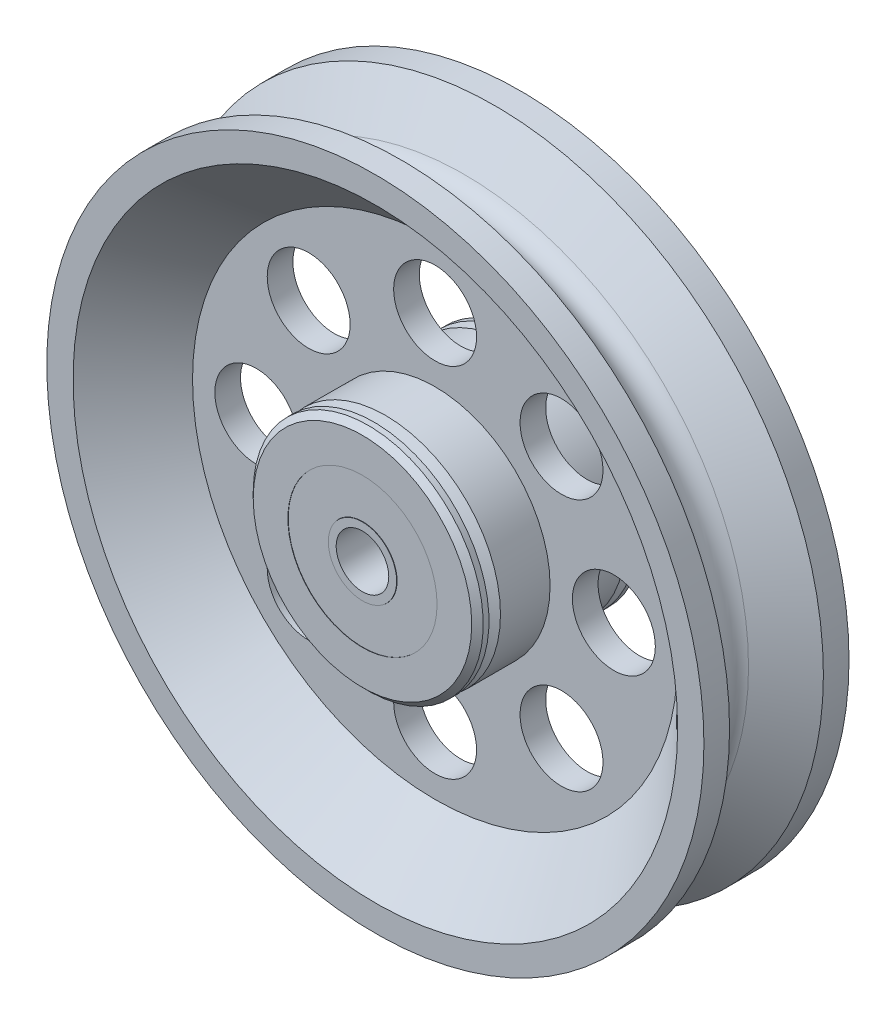
ISO-10303-21;
HEADER;
FILE_DESCRIPTION(('STEP AP214'),'2;1');
FILE_NAME('part.step','',(''),(''),'','','');
FILE_SCHEMA(('AUTOMOTIVE_DESIGN { 1 0 10303 214 1 1 1 1 }'));
ENDSEC;
DATA;
#1=APPLICATION_CONTEXT('core data for automotive mechanical design processes');
#2=APPLICATION_PROTOCOL_DEFINITION('international standard','automotive_design',2000,#1);
#3=PRODUCT_CONTEXT('',#1,'mechanical');
#4=PRODUCT('Part','Part','',(#3));
#5=PRODUCT_RELATED_PRODUCT_CATEGORY('part','',(#4));
#6=PRODUCT_DEFINITION_FORMATION('','',#4);
#7=PRODUCT_DEFINITION_CONTEXT('part definition',#1,'design');
#8=PRODUCT_DEFINITION('design','',#6,#7);
#9=PRODUCT_DEFINITION_SHAPE('','',#8);
#10=(LENGTH_UNIT() NAMED_UNIT(*) SI_UNIT(.MILLI.,.METRE.));
#11=(NAMED_UNIT(*) PLANE_ANGLE_UNIT() SI_UNIT($,.RADIAN.));
#12=(NAMED_UNIT(*) SI_UNIT($,.STERADIAN.) SOLID_ANGLE_UNIT());
#13=UNCERTAINTY_MEASURE_WITH_UNIT(LENGTH_MEASURE(1.E-05),#10,'distance_accuracy_value','');
#14=(GEOMETRIC_REPRESENTATION_CONTEXT(3) GLOBAL_UNCERTAINTY_ASSIGNED_CONTEXT((#13)) GLOBAL_UNIT_ASSIGNED_CONTEXT((#10,
#11,#12)) REPRESENTATION_CONTEXT('',''));
#15=CARTESIAN_POINT('',(0.,0.,0.));
#16=DIRECTION('',(0.,0.,1.));
#17=DIRECTION('',(1.,0.,0.));
#18=AXIS2_PLACEMENT_3D('',#15,#16,#17);
#19=CARTESIAN_POINT('',(0.,0.,20.6375));
#20=DIRECTION('',(0.,0.,1.));
#21=DIRECTION('',(1.,0.,0.));
#22=AXIS2_PLACEMENT_3D('',#19,#20,#21);
#23=CYLINDRICAL_SURFACE('',#22,27.78125);
#24=CARTESIAN_POINT('',(0.,0.,-17.859375));
#25=DIRECTION('',(0.,0.,-1.));
#26=DIRECTION('',(-1.,0.,0.));
#27=AXIS2_PLACEMENT_3D('',#24,#25,#26);
#28=CIRCLE('',#27,27.78125);
#29=CARTESIAN_POINT('',(-27.78125,0.,-17.859375));
#30=VERTEX_POINT('',#29);
#31=EDGE_CURVE('E129',#30,#30,#28,.T.);
#32=ORIENTED_EDGE('',*,*,#31,.T.);
#33=EDGE_LOOP('',(#32));
#34=FACE_BOUND('',#33,.T.);
#35=CARTESIAN_POINT('',(0.,0.,-19.2484375));
#36=DIRECTION('',(0.,0.,1.));
#37=DIRECTION('',(1.,0.,0.));
#38=AXIS2_PLACEMENT_3D('',#35,#36,#37);
#39=CIRCLE('',#38,27.78125);
#40=CARTESIAN_POINT('',(27.78125,0.,-19.2484375));
#41=VERTEX_POINT('',#40);
#42=EDGE_CURVE('E191',#41,#41,#39,.T.);
#43=ORIENTED_EDGE('',*,*,#42,.T.);
#44=EDGE_LOOP('',(#43));
#45=FACE_BOUND('',#44,.T.);
#46=ADVANCED_FACE('F57',(#34,#45),#23,.T.);
#47=CARTESIAN_POINT('',(0.,0.,20.6375));
#48=DIRECTION('',(0.,0.,1.));
#49=DIRECTION('',(1.,0.,0.));
#50=AXIS2_PLACEMENT_3D('',#47,#48,#49);
#51=CYLINDRICAL_SURFACE('',#50,27.78125);
#52=CARTESIAN_POINT('',(0.,0.,17.859375));
#53=DIRECTION('',(0.,0.,-1.));
#54=DIRECTION('',(-1.,0.,0.));
#55=AXIS2_PLACEMENT_3D('',#52,#53,#54);
#56=CIRCLE('',#55,27.78125);
#57=CARTESIAN_POINT('',(-27.78125,0.,17.859375));
#58=VERTEX_POINT('',#57);
#59=EDGE_CURVE('E138',#58,#58,#56,.T.);
#60=ORIENTED_EDGE('',*,*,#59,.F.);
#61=EDGE_LOOP('',(#60));
#62=FACE_BOUND('',#61,.T.);
#63=CARTESIAN_POINT('',(0.,0.,19.2484375));
#64=DIRECTION('',(0.,0.,-1.));
#65=DIRECTION('',(-1.,0.,0.));
#66=AXIS2_PLACEMENT_3D('',#63,#64,#65);
#67=CIRCLE('',#66,27.78125);
#68=CARTESIAN_POINT('',(-27.78125,0.,19.2484375));
#69=VERTEX_POINT('',#68);
#70=EDGE_CURVE('E12',#69,#69,#67,.T.);
#71=ORIENTED_EDGE('',*,*,#70,.T.);
#72=EDGE_LOOP('',(#71));
#73=FACE_BOUND('',#72,.T.);
#74=ADVANCED_FACE('F210',(#62,#73),#51,.T.);
#75=CARTESIAN_POINT('',(0.,0.,0.));
#76=DIRECTION('',(0.,0.,1.));
#77=DIRECTION('',(1.,0.,0.));
#78=AXIS2_PLACEMENT_3D('',#75,#76,#77);
#79=TOROIDAL_SURFACE('',#78,71.4375,4.76249999999999);
#80=CARTESIAN_POINT('',(0.,0.,3.9075855517827));
#81=DIRECTION('',(0.,0.,1.));
#82=DIRECTION('',(1.,0.,0.));
#83=AXIS2_PLACEMENT_3D('',#80,#81,#82);
#84=CIRCLE('',#83,68.7149678320543);
#85=CARTESIAN_POINT('',(68.7149678320543,0.,3.9075855517827));
#86=VERTEX_POINT('',#85);
#87=EDGE_CURVE('E147',#86,#86,#84,.T.);
#88=ORIENTED_EDGE('',*,*,#87,.F.);
#89=EDGE_LOOP('',(#88));
#90=FACE_BOUND('',#89,.T.);
#91=CARTESIAN_POINT('',(0.,0.,-3.9075855517827));
#92=DIRECTION('',(0.,0.,1.));
#93=DIRECTION('',(1.,0.,0.));
#94=AXIS2_PLACEMENT_3D('',#91,#92,#93);
#95=CIRCLE('',#94,68.7149678320543);
#96=CARTESIAN_POINT('',(68.7149678320543,0.,-3.9075855517827));
#97=VERTEX_POINT('',#96);
#98=EDGE_CURVE('E141',#97,#97,#95,.T.);
#99=ORIENTED_EDGE('',*,*,#98,.T.);
#100=EDGE_LOOP('',(#99));
#101=FACE_BOUND('',#100,.T.);
#102=ADVANCED_FACE('F217',(#90,#101),#79,.F.);
#103=CARTESIAN_POINT('',(0.,0.,3.9075855517827));
#104=DIRECTION('',(0.,0.,1.));
#105=DIRECTION('',(1.,0.,0.));
#106=AXIS2_PLACEMENT_3D('',#103,#104,#105);
#107=CONICAL_SURFACE('',#106,68.7149678320543,0.962268351515033);
#108=CARTESIAN_POINT('',(0.,0.,11.33475));
#109=DIRECTION('',(0.,0.,1.));
#110=DIRECTION('',(1.,0.,0.));
#111=AXIS2_PLACEMENT_3D('',#108,#109,#110);
#112=CIRCLE('',#111,79.375);
#113=CARTESIAN_POINT('',(79.375,0.,11.33475));
#114=VERTEX_POINT('',#113);
#115=EDGE_CURVE('E150',#114,#114,#112,.T.);
#116=ORIENTED_EDGE('',*,*,#115,.F.);
#117=EDGE_LOOP('',(#116));
#118=FACE_BOUND('',#117,.T.);
#119=ORIENTED_EDGE('',*,*,#87,.T.);
#120=EDGE_LOOP('',(#119));
#121=FACE_BOUND('',#120,.T.);
#122=ADVANCED_FACE('F264',(#118,#121),#107,.T.);
#123=CARTESIAN_POINT('',(0.,0.,20.6375));
#124=DIRECTION('',(0.,0.,1.));
#125=DIRECTION('',(1.,0.,0.));
#126=AXIS2_PLACEMENT_3D('',#123,#124,#125);
#127=CYLINDRICAL_SURFACE('',#126,79.375);
#128=CARTESIAN_POINT('',(0.,0.,17.526));
#129=DIRECTION('',(0.,0.,1.));
#130=DIRECTION('',(1.,0.,0.));
#131=AXIS2_PLACEMENT_3D('',#128,#129,#130);
#132=CIRCLE('',#131,79.375);
#133=CARTESIAN_POINT('',(79.375,0.,17.526));
#134=VERTEX_POINT('',#133);
#135=EDGE_CURVE('E153',#134,#134,#132,.T.);
#136=ORIENTED_EDGE('',*,*,#135,.F.);
#137=EDGE_LOOP('',(#136));
#138=FACE_BOUND('',#137,.T.);
#139=ORIENTED_EDGE('',*,*,#115,.T.);
#140=EDGE_LOOP('',(#139));
#141=FACE_BOUND('',#140,.T.);
#142=ADVANCED_FACE('F268',(#138,#141),#127,.T.);
#143=CARTESIAN_POINT('',(0.,73.025,17.526));
#144=DIRECTION('',(0.,0.,-1.));
#145=DIRECTION('',(-1.,0.,0.));
#146=AXIS2_PLACEMENT_3D('',#143,#144,#145);
#147=PLANE('',#146);
#148=CARTESIAN_POINT('',(0.,0.,17.526));
#149=DIRECTION('',(0.,0.,1.));
#150=DIRECTION('',(1.,0.,0.));
#151=AXIS2_PLACEMENT_3D('',#148,#149,#150);
#152=CIRCLE('',#151,73.025);
#153=CARTESIAN_POINT('',(73.025,0.,17.526));
#154=VERTEX_POINT('',#153);
#155=EDGE_CURVE('E156',#154,#154,#152,.T.);
#156=ORIENTED_EDGE('',*,*,#155,.F.);
#157=EDGE_LOOP('',(#156));
#158=FACE_BOUND('',#157,.T.);
#159=ORIENTED_EDGE('',*,*,#135,.T.);
#160=EDGE_LOOP('',(#159));
#161=FACE_BOUND('',#160,.T.);
#162=ADVANCED_FACE('F272',(#158,#161),#147,.F.);
#163=CARTESIAN_POINT('',(0.,0.,17.526));
#164=DIRECTION('',(0.,0.,1.));
#165=DIRECTION('',(1.,0.,0.));
#166=AXIS2_PLACEMENT_3D('',#163,#164,#165);
#167=CONICAL_SURFACE('',#166,73.025,0.785398163397446);
#168=CARTESIAN_POINT('',(0.,0.,3.09562499999999));
#169=DIRECTION('',(0.,0.,1.));
#170=DIRECTION('',(1.,0.,0.));
#171=AXIS2_PLACEMENT_3D('',#168,#169,#170);
#172=CIRCLE('',#171,58.5946250000001);
#173=CARTESIAN_POINT('',(58.5946250000001,0.,3.09562499999999));
#174=VERTEX_POINT('',#173);
#175=EDGE_CURVE('E159',#174,#174,#172,.T.);
#176=ORIENTED_EDGE('',*,*,#175,.F.);
#177=EDGE_LOOP('',(#176));
#178=FACE_BOUND('',#177,.T.);
#179=ORIENTED_EDGE('',*,*,#155,.T.);
#180=EDGE_LOOP('',(#179));
#181=FACE_BOUND('',#180,.T.);
#182=ADVANCED_FACE('F276',(#178,#181),#167,.F.);
#183=CARTESIAN_POINT('',(0.,58.5946250000001,3.095625));
#184=DIRECTION('',(0.,0.,-1.));
#185=DIRECTION('',(-1.,0.,0.));
#186=AXIS2_PLACEMENT_3D('',#183,#184,#185);
#187=PLANE('',#186);
#188=CARTESIAN_POINT('',(30.5384834717104,30.5384834717112,3.095625));
#189=DIRECTION('',(0.,0.,-1.));
#190=DIRECTION('',(-1.,0.,0.));
#191=AXIS2_PLACEMENT_3D('',#188,#189,#190);
#192=CIRCLE('',#191,10.014346875);
#193=CARTESIAN_POINT('',(20.5241365967104,30.5384834717112,3.095625));
#194=VERTEX_POINT('',#193);
#195=EDGE_CURVE('E100',#194,#194,#192,.T.);
#196=ORIENTED_EDGE('',*,*,#195,.T.);
#197=EDGE_LOOP('',(#196));
#198=FACE_BOUND('',#197,.T.);
#199=CARTESIAN_POINT('',(43.1879375,4.51583234245091E-13,3.095625));
#200=DIRECTION('',(0.,0.,-1.));
#201=DIRECTION('',(-1.,0.,0.));
#202=AXIS2_PLACEMENT_3D('',#199,#200,#201);
#203=CIRCLE('',#202,10.014346875);
#204=CARTESIAN_POINT('',(33.173590625,4.51583234245091E-13,3.095625));
#205=VERTEX_POINT('',#204);
#206=EDGE_CURVE('E97',#205,#205,#203,.T.);
#207=ORIENTED_EDGE('',*,*,#206,.T.);
#208=EDGE_LOOP('',(#207));
#209=FACE_BOUND('',#208,.T.);
#210=CARTESIAN_POINT('',(30.5384834717111,-30.5384834717105,3.095625));
#211=DIRECTION('',(0.,0.,-1.));
#212=DIRECTION('',(-1.,0.,0.));
#213=AXIS2_PLACEMENT_3D('',#210,#211,#212);
#214=CIRCLE('',#213,10.014346875);
#215=CARTESIAN_POINT('',(20.5241365967111,-30.5384834717105,3.095625));
#216=VERTEX_POINT('',#215);
#217=EDGE_CURVE('E94',#216,#216,#214,.T.);
#218=ORIENTED_EDGE('',*,*,#217,.T.);
#219=EDGE_LOOP('',(#218));
#220=FACE_BOUND('',#219,.T.);
#221=CARTESIAN_POINT('',(0.,-43.1879375,3.095625));
#222=DIRECTION('',(0.,0.,-1.));
#223=DIRECTION('',(-1.,0.,0.));
#224=AXIS2_PLACEMENT_3D('',#221,#222,#223);
#225=CIRCLE('',#224,10.014346875);
#226=CARTESIAN_POINT('',(-10.014346875,-43.1879375,3.095625));
#227=VERTEX_POINT('',#226);
#228=EDGE_CURVE('E90',#227,#227,#225,.T.);
#229=ORIENTED_EDGE('',*,*,#228,.T.);
#230=EDGE_LOOP('',(#229));
#231=FACE_BOUND('',#230,.T.);
#232=CARTESIAN_POINT('',(-30.5384834717107,-30.538483471711,3.095625));
#233=DIRECTION('',(0.,0.,-1.));
#234=DIRECTION('',(-1.,0.,0.));
#235=AXIS2_PLACEMENT_3D('',#232,#233,#234);
#236=CIRCLE('',#235,10.014346875);
#237=CARTESIAN_POINT('',(-40.5528303467107,-30.538483471711,3.095625));
#238=VERTEX_POINT('',#237);
#239=EDGE_CURVE('E86',#238,#238,#236,.T.);
#240=ORIENTED_EDGE('',*,*,#239,.T.);
#241=EDGE_LOOP('',(#240));
#242=FACE_BOUND('',#241,.T.);
#243=CARTESIAN_POINT('',(-43.1879375,-1.50003478556344E-13,3.095625));
#244=DIRECTION('',(0.,0.,-1.));
#245=DIRECTION('',(-1.,0.,0.));
#246=AXIS2_PLACEMENT_3D('',#243,#244,#245);
#247=CIRCLE('',#246,10.014346875);
#248=CARTESIAN_POINT('',(-53.2022843750001,-1.50003478556344E-13,3.095625));
#249=VERTEX_POINT('',#248);
#250=EDGE_CURVE('E82',#249,#249,#247,.T.);
#251=ORIENTED_EDGE('',*,*,#250,.T.);
#252=EDGE_LOOP('',(#251));
#253=FACE_BOUND('',#252,.T.);
#254=CARTESIAN_POINT('',(-30.5384834717109,30.5384834717108,3.095625));
#255=DIRECTION('',(0.,0.,-1.));
#256=DIRECTION('',(-1.,0.,0.));
#257=AXIS2_PLACEMENT_3D('',#254,#255,#256);
#258=CIRCLE('',#257,10.014346875);
#259=CARTESIAN_POINT('',(-40.5528303467109,30.5384834717108,3.095625));
#260=VERTEX_POINT('',#259);
#261=EDGE_CURVE('E78',#260,#260,#258,.T.);
#262=ORIENTED_EDGE('',*,*,#261,.T.);
#263=EDGE_LOOP('',(#262));
#264=FACE_BOUND('',#263,.T.);
#265=CARTESIAN_POINT('',(0.,43.1879375,3.095625));
#266=DIRECTION('',(0.,0.,-1.));
#267=DIRECTION('',(-1.,0.,0.));
#268=AXIS2_PLACEMENT_3D('',#265,#266,#267);
#269=CIRCLE('',#268,10.014346875);
#270=CARTESIAN_POINT('',(-10.014346875,43.1879375,3.095625));
#271=VERTEX_POINT('',#270);
#272=EDGE_CURVE('E77',#271,#271,#269,.T.);
#273=ORIENTED_EDGE('',*,*,#272,.T.);
#274=EDGE_LOOP('',(#273));
#275=FACE_BOUND('',#274,.T.);
#276=CARTESIAN_POINT('',(0.,0.,3.095625));
#277=DIRECTION('',(0.,0.,1.));
#278=DIRECTION('',(1.,0.,0.));
#279=AXIS2_PLACEMENT_3D('',#276,#277,#278);
#280=CIRCLE('',#279,27.78125);
#281=CARTESIAN_POINT('',(27.78125,0.,3.095625));
#282=VERTEX_POINT('',#281);
#283=EDGE_CURVE('E162',#282,#282,#280,.T.);
#284=ORIENTED_EDGE('',*,*,#283,.F.);
#285=EDGE_LOOP('',(#284));
#286=FACE_BOUND('',#285,.T.);
#287=ORIENTED_EDGE('',*,*,#175,.T.);
#288=EDGE_LOOP('',(#287));
#289=FACE_BOUND('',#288,.T.);
#290=ADVANCED_FACE('F280',(#198,#209,#220,#231,#242,#253,#264,#275,#286,#289),#187,.F.);
#291=CARTESIAN_POINT('',(0.,0.,15.08125));
#292=DIRECTION('',(0.,0.,-1.));
#293=DIRECTION('',(-1.,0.,0.));
#294=AXIS2_PLACEMENT_3D('',#291,#292,#293);
#295=CIRCLE('',#294,27.78125);
#296=CARTESIAN_POINT('',(-27.78125,0.,15.08125));
#297=VERTEX_POINT('',#296);
#298=EDGE_CURVE('E132',#297,#297,#295,.T.);
#299=ORIENTED_EDGE('',*,*,#298,.T.);
#300=EDGE_LOOP('',(#299));
#301=FACE_BOUND('',#300,.T.);
#302=ORIENTED_EDGE('',*,*,#283,.T.);
#303=EDGE_LOOP('',(#302));
#304=FACE_BOUND('',#303,.T.);
#305=ADVANCED_FACE('F220',(#301,#304),#51,.T.);
#306=CARTESIAN_POINT('',(0.,18.018125,20.6375));
#307=DIRECTION('',(0.,0.,-1.));
#308=DIRECTION('',(-1.,0.,0.));
#309=AXIS2_PLACEMENT_3D('',#306,#307,#308);
#310=PLANE('',#309);
#311=CARTESIAN_POINT('',(0.,0.,20.6375));
#312=DIRECTION('',(0.,0.,-1.));
#313=DIRECTION('',(-1.,0.,0.));
#314=AXIS2_PLACEMENT_3D('',#311,#312,#313);
#315=CIRCLE('',#314,26.3921875);
#316=CARTESIAN_POINT('',(-26.3921875,0.,20.6375));
#317=VERTEX_POINT('',#316);
#318=EDGE_CURVE('E65',#317,#317,#315,.F.);
#319=ORIENTED_EDGE('',*,*,#318,.T.);
#320=EDGE_LOOP('',(#319));
#321=FACE_BOUND('',#320,.T.);
#322=CARTESIAN_POINT('',(0.,0.,20.6375));
#323=DIRECTION('',(0.,0.,1.));
#324=DIRECTION('',(1.,0.,0.));
#325=AXIS2_PLACEMENT_3D('',#322,#323,#324);
#326=CIRCLE('',#325,18.018125);
#327=CARTESIAN_POINT('',(18.018125,0.,20.6375));
#328=VERTEX_POINT('',#327);
#329=EDGE_CURVE('E165',#328,#328,#326,.T.);
#330=ORIENTED_EDGE('',*,*,#329,.F.);
#331=EDGE_LOOP('',(#330));
#332=FACE_BOUND('',#331,.T.);
#333=ADVANCED_FACE('F285',(#321,#332),#310,.F.);
#334=CARTESIAN_POINT('',(0.,0.,20.6375));
#335=DIRECTION('',(0.,0.,1.));
#336=DIRECTION('',(1.,0.,0.));
#337=AXIS2_PLACEMENT_3D('',#334,#335,#336);
#338=CYLINDRICAL_SURFACE('',#337,18.018125);
#339=CARTESIAN_POINT('',(0.,0.,20.5613));
#340=DIRECTION('',(0.,0.,1.));
#341=DIRECTION('',(1.,0.,0.));
#342=AXIS2_PLACEMENT_3D('',#339,#340,#341);
#343=CIRCLE('',#342,18.018125);
#344=CARTESIAN_POINT('',(18.018125,0.,20.5613));
#345=VERTEX_POINT('',#344);
#346=EDGE_CURVE('E146',#345,#345,#343,.T.);
#347=ORIENTED_EDGE('',*,*,#346,.F.);
#348=EDGE_LOOP('',(#347));
#349=FACE_BOUND('',#348,.T.);
#350=ORIENTED_EDGE('',*,*,#329,.T.);
#351=EDGE_LOOP('',(#350));
#352=FACE_BOUND('',#351,.T.);
#353=ADVANCED_FACE('F289',(#349,#352),#338,.F.);
#354=CARTESIAN_POINT('',(0.,8.255,20.5613));
#355=DIRECTION('',(0.,0.,-1.));
#356=DIRECTION('',(-1.,0.,0.));
#357=AXIS2_PLACEMENT_3D('',#354,#355,#356);
#358=PLANE('',#357);
#359=CARTESIAN_POINT('',(0.,0.,20.5613));
#360=DIRECTION('',(0.,0.,-1.));
#361=DIRECTION('',(-1.,0.,0.));
#362=AXIS2_PLACEMENT_3D('',#359,#360,#361);
#363=CIRCLE('',#362,8.2804);
#364=CARTESIAN_POINT('',(-8.2804,0.,20.5613));
#365=VERTEX_POINT('',#364);
#366=EDGE_CURVE('E168',#365,#365,#363,.T.);
#367=ORIENTED_EDGE('',*,*,#366,.T.);
#368=EDGE_LOOP('',(#367));
#369=FACE_BOUND('',#368,.T.);
#370=ORIENTED_EDGE('',*,*,#346,.T.);
#371=EDGE_LOOP('',(#370));
#372=FACE_BOUND('',#371,.T.);
#373=ADVANCED_FACE('F293',(#369,#372),#358,.F.);
#374=CARTESIAN_POINT('',(0.,18.018125,-20.5613));
#375=DIRECTION('',(0.,0.,1.));
#376=DIRECTION('',(1.,0.,0.));
#377=AXIS2_PLACEMENT_3D('',#374,#375,#376);
#378=PLANE('',#377);
#379=CARTESIAN_POINT('',(0.,0.,-20.5613));
#380=DIRECTION('',(0.,0.,1.));
#381=DIRECTION('',(1.,0.,0.));
#382=AXIS2_PLACEMENT_3D('',#379,#380,#381);
#383=CIRCLE('',#382,8.2804);
#384=CARTESIAN_POINT('',(8.2804,0.,-20.5613));
#385=VERTEX_POINT('',#384);
#386=EDGE_CURVE('E142',#385,#385,#383,.T.);
#387=ORIENTED_EDGE('',*,*,#386,.T.);
#388=EDGE_LOOP('',(#387));
#389=FACE_BOUND('',#388,.T.);
#390=CARTESIAN_POINT('',(0.,0.,-20.5613));
#391=DIRECTION('',(0.,0.,1.));
#392=DIRECTION('',(1.,0.,0.));
#393=AXIS2_PLACEMENT_3D('',#390,#391,#392);
#394=CIRCLE('',#393,18.018125);
#395=CARTESIAN_POINT('',(18.018125,0.,-20.5613));
#396=VERTEX_POINT('',#395);
#397=EDGE_CURVE('E145',#396,#396,#394,.T.);
#398=ORIENTED_EDGE('',*,*,#397,.F.);
#399=EDGE_LOOP('',(#398));
#400=FACE_BOUND('',#399,.T.);
#401=ADVANCED_FACE('F297',(#389,#400),#378,.F.);
#402=CARTESIAN_POINT('',(0.,0.,20.6375));
#403=DIRECTION('',(0.,0.,1.));
#404=DIRECTION('',(1.,0.,0.));
#405=AXIS2_PLACEMENT_3D('',#402,#403,#404);
#406=CYLINDRICAL_SURFACE('',#405,18.018125);
#407=CARTESIAN_POINT('',(0.,0.,-20.6375));
#408=DIRECTION('',(0.,0.,1.));
#409=DIRECTION('',(1.,0.,0.));
#410=AXIS2_PLACEMENT_3D('',#407,#408,#409);
#411=CIRCLE('',#410,18.018125);
#412=CARTESIAN_POINT('',(18.018125,0.,-20.6375));
#413=VERTEX_POINT('',#412);
#414=EDGE_CURVE('E173',#413,#413,#411,.T.);
#415=ORIENTED_EDGE('',*,*,#414,.F.);
#416=EDGE_LOOP('',(#415));
#417=FACE_BOUND('',#416,.T.);
#418=ORIENTED_EDGE('',*,*,#397,.T.);
#419=EDGE_LOOP('',(#418));
#420=FACE_BOUND('',#419,.T.);
#421=ADVANCED_FACE('F232',(#417,#420),#406,.F.);
#422=CARTESIAN_POINT('',(0.,27.78125,-20.6375));
#423=DIRECTION('',(0.,0.,1.));
#424=DIRECTION('',(1.,0.,0.));
#425=AXIS2_PLACEMENT_3D('',#422,#423,#424);
#426=PLANE('',#425);
#427=CARTESIAN_POINT('',(0.,0.,-20.6375));
#428=DIRECTION('',(0.,0.,1.));
#429=DIRECTION('',(1.,0.,0.));
#430=AXIS2_PLACEMENT_3D('',#427,#428,#429);
#431=CIRCLE('',#430,26.3921875);
#432=CARTESIAN_POINT('',(26.3921875,0.,-20.6375));
#433=VERTEX_POINT('',#432);
#434=EDGE_CURVE('E70',#433,#433,#431,.F.);
#435=ORIENTED_EDGE('',*,*,#434,.T.);
#436=EDGE_LOOP('',(#435));
#437=FACE_BOUND('',#436,.T.);
#438=ORIENTED_EDGE('',*,*,#414,.T.);
#439=EDGE_LOOP('',(#438));
#440=FACE_BOUND('',#439,.T.);
#441=ADVANCED_FACE('F200',(#437,#440),#426,.F.);
#442=CARTESIAN_POINT('',(0.,0.,-15.08125));
#443=DIRECTION('',(0.,0.,-1.));
#444=DIRECTION('',(-1.,0.,0.));
#445=AXIS2_PLACEMENT_3D('',#442,#443,#444);
#446=CIRCLE('',#445,27.78125);
#447=CARTESIAN_POINT('',(-27.78125,0.,-15.08125));
#448=VERTEX_POINT('',#447);
#449=EDGE_CURVE('E123',#448,#448,#446,.T.);
#450=ORIENTED_EDGE('',*,*,#449,.F.);
#451=EDGE_LOOP('',(#450));
#452=FACE_BOUND('',#451,.T.);
#453=CARTESIAN_POINT('',(0.,0.,-3.095625));
#454=DIRECTION('',(0.,0.,1.));
#455=DIRECTION('',(1.,0.,0.));
#456=AXIS2_PLACEMENT_3D('',#453,#454,#455);
#457=CIRCLE('',#456,27.78125);
#458=CARTESIAN_POINT('',(27.78125,0.,-3.095625));
#459=VERTEX_POINT('',#458);
#460=EDGE_CURVE('E176',#459,#459,#457,.T.);
#461=ORIENTED_EDGE('',*,*,#460,.F.);
#462=EDGE_LOOP('',(#461));
#463=FACE_BOUND('',#462,.T.);
#464=ADVANCED_FACE('F213',(#452,#463),#23,.T.);
#465=CARTESIAN_POINT('',(0.,58.5946250000001,-3.095625));
#466=DIRECTION('',(0.,0.,1.));
#467=DIRECTION('',(1.,0.,0.));
#468=AXIS2_PLACEMENT_3D('',#465,#466,#467);
#469=PLANE('',#468);
#470=CARTESIAN_POINT('',(30.5384834717104,30.5384834717112,-3.095625));
#471=DIRECTION('',(0.,0.,1.));
#472=DIRECTION('',(1.,0.,0.));
#473=AXIS2_PLACEMENT_3D('',#470,#471,#472);
#474=CIRCLE('',#473,10.014346875);
#475=CARTESIAN_POINT('',(40.5528303467105,30.5384834717112,-3.095625));
#476=VERTEX_POINT('',#475);
#477=EDGE_CURVE('E61',#476,#476,#474,.T.);
#478=ORIENTED_EDGE('',*,*,#477,.T.);
#479=EDGE_LOOP('',(#478));
#480=FACE_BOUND('',#479,.T.);
#481=CARTESIAN_POINT('',(43.1879375,4.51583234245091E-13,-3.095625));
#482=DIRECTION('',(0.,0.,1.));
#483=DIRECTION('',(1.,0.,0.));
#484=AXIS2_PLACEMENT_3D('',#481,#482,#483);
#485=CIRCLE('',#484,10.014346875);
#486=CARTESIAN_POINT('',(53.2022843750001,4.51583234245091E-13,-3.095625));
#487=VERTEX_POINT('',#486);
#488=EDGE_CURVE('E98',#487,#487,#485,.T.);
#489=ORIENTED_EDGE('',*,*,#488,.T.);
#490=EDGE_LOOP('',(#489));
#491=FACE_BOUND('',#490,.T.);
#492=CARTESIAN_POINT('',(30.5384834717111,-30.5384834717105,-3.095625));
#493=DIRECTION('',(0.,0.,1.));
#494=DIRECTION('',(1.,0.,0.));
#495=AXIS2_PLACEMENT_3D('',#492,#493,#494);
#496=CIRCLE('',#495,10.014346875);
#497=CARTESIAN_POINT('',(40.5528303467111,-30.5384834717105,-3.095625));
#498=VERTEX_POINT('',#497);
#499=EDGE_CURVE('E95',#498,#498,#496,.T.);
#500=ORIENTED_EDGE('',*,*,#499,.T.);
#501=EDGE_LOOP('',(#500));
#502=FACE_BOUND('',#501,.T.);
#503=CARTESIAN_POINT('',(0.,-43.1879375,-3.095625));
#504=DIRECTION('',(0.,0.,1.));
#505=DIRECTION('',(1.,0.,0.));
#506=AXIS2_PLACEMENT_3D('',#503,#504,#505);
#507=CIRCLE('',#506,10.014346875);
#508=CARTESIAN_POINT('',(10.014346875,-43.1879375,-3.095625));
#509=VERTEX_POINT('',#508);
#510=EDGE_CURVE('E91',#509,#509,#507,.T.);
#511=ORIENTED_EDGE('',*,*,#510,.T.);
#512=EDGE_LOOP('',(#511));
#513=FACE_BOUND('',#512,.T.);
#514=CARTESIAN_POINT('',(-30.5384834717107,-30.538483471711,-3.095625));
#515=DIRECTION('',(0.,0.,1.));
#516=DIRECTION('',(1.,0.,0.));
#517=AXIS2_PLACEMENT_3D('',#514,#515,#516);
#518=CIRCLE('',#517,10.014346875);
#519=CARTESIAN_POINT('',(-20.5241365967106,-30.538483471711,-3.095625));
#520=VERTEX_POINT('',#519);
#521=EDGE_CURVE('E87',#520,#520,#518,.T.);
#522=ORIENTED_EDGE('',*,*,#521,.T.);
#523=EDGE_LOOP('',(#522));
#524=FACE_BOUND('',#523,.T.);
#525=CARTESIAN_POINT('',(-43.1879375,-1.50003478556344E-13,-3.095625));
#526=DIRECTION('',(0.,0.,1.));
#527=DIRECTION('',(1.,0.,0.));
#528=AXIS2_PLACEMENT_3D('',#525,#526,#527);
#529=CIRCLE('',#528,10.014346875);
#530=CARTESIAN_POINT('',(-33.173590625,-1.50003478556344E-13,-3.095625));
#531=VERTEX_POINT('',#530);
#532=EDGE_CURVE('E83',#531,#531,#529,.T.);
#533=ORIENTED_EDGE('',*,*,#532,.T.);
#534=EDGE_LOOP('',(#533));
#535=FACE_BOUND('',#534,.T.);
#536=CARTESIAN_POINT('',(-30.5384834717109,30.5384834717108,-3.095625));
#537=DIRECTION('',(0.,0.,1.));
#538=DIRECTION('',(1.,0.,0.));
#539=AXIS2_PLACEMENT_3D('',#536,#537,#538);
#540=CIRCLE('',#539,10.014346875);
#541=CARTESIAN_POINT('',(-20.5241365967108,30.5384834717108,-3.095625));
#542=VERTEX_POINT('',#541);
#543=EDGE_CURVE('E79',#542,#542,#540,.T.);
#544=ORIENTED_EDGE('',*,*,#543,.T.);
#545=EDGE_LOOP('',(#544));
#546=FACE_BOUND('',#545,.T.);
#547=CARTESIAN_POINT('',(0.,43.1879375,-3.095625));
#548=DIRECTION('',(0.,0.,1.));
#549=DIRECTION('',(1.,0.,0.));
#550=AXIS2_PLACEMENT_3D('',#547,#548,#549);
#551=CIRCLE('',#550,10.014346875);
#552=CARTESIAN_POINT('',(10.014346875,43.1879375,-3.095625));
#553=VERTEX_POINT('',#552);
#554=EDGE_CURVE('E74',#553,#553,#551,.T.);
#555=ORIENTED_EDGE('',*,*,#554,.T.);
#556=EDGE_LOOP('',(#555));
#557=FACE_BOUND('',#556,.T.);
#558=CARTESIAN_POINT('',(0.,0.,-3.095625));
#559=DIRECTION('',(0.,0.,1.));
#560=DIRECTION('',(1.,0.,0.));
#561=AXIS2_PLACEMENT_3D('',#558,#559,#560);
#562=CIRCLE('',#561,58.5946250000001);
#563=CARTESIAN_POINT('',(58.5946250000001,0.,-3.095625));
#564=VERTEX_POINT('',#563);
#565=EDGE_CURVE('E179',#564,#564,#562,.T.);
#566=ORIENTED_EDGE('',*,*,#565,.F.);
#567=EDGE_LOOP('',(#566));
#568=FACE_BOUND('',#567,.T.);
#569=ORIENTED_EDGE('',*,*,#460,.T.);
#570=EDGE_LOOP('',(#569));
#571=FACE_BOUND('',#570,.T.);
#572=ADVANCED_FACE('F224',(#480,#491,#502,#513,#524,#535,#546,#557,#568,#571),#469,.F.);
#573=CARTESIAN_POINT('',(0.,0.,-3.095625));
#574=DIRECTION('',(0.,0.,-1.));
#575=DIRECTION('',(-1.,0.,0.));
#576=AXIS2_PLACEMENT_3D('',#573,#574,#575);
#577=CONICAL_SURFACE('',#576,58.5946250000001,0.785398163397446);
#578=CARTESIAN_POINT('',(0.,0.,-17.526));
#579=DIRECTION('',(0.,0.,1.));
#580=DIRECTION('',(1.,0.,0.));
#581=AXIS2_PLACEMENT_3D('',#578,#579,#580);
#582=CIRCLE('',#581,73.025);
#583=CARTESIAN_POINT('',(73.025,0.,-17.526));
#584=VERTEX_POINT('',#583);
#585=EDGE_CURVE('E182',#584,#584,#582,.T.);
#586=ORIENTED_EDGE('',*,*,#585,.F.);
#587=EDGE_LOOP('',(#586));
#588=FACE_BOUND('',#587,.T.);
#589=ORIENTED_EDGE('',*,*,#565,.T.);
#590=EDGE_LOOP('',(#589));
#591=FACE_BOUND('',#590,.T.);
#592=ADVANCED_FACE('F230',(#588,#591),#577,.F.);
#593=CARTESIAN_POINT('',(0.,79.375,-17.526));
#594=DIRECTION('',(0.,0.,1.));
#595=DIRECTION('',(1.,0.,0.));
#596=AXIS2_PLACEMENT_3D('',#593,#594,#595);
#597=PLANE('',#596);
#598=CARTESIAN_POINT('',(0.,0.,-17.526));
#599=DIRECTION('',(0.,0.,1.));
#600=DIRECTION('',(1.,0.,0.));
#601=AXIS2_PLACEMENT_3D('',#598,#599,#600);
#602=CIRCLE('',#601,79.375);
#603=CARTESIAN_POINT('',(79.375,0.,-17.526));
#604=VERTEX_POINT('',#603);
#605=EDGE_CURVE('E185',#604,#604,#602,.T.);
#606=ORIENTED_EDGE('',*,*,#605,.F.);
#607=EDGE_LOOP('',(#606));
#608=FACE_BOUND('',#607,.T.);
#609=ORIENTED_EDGE('',*,*,#585,.T.);
#610=EDGE_LOOP('',(#609));
#611=FACE_BOUND('',#610,.T.);
#612=ADVANCED_FACE('F493',(#608,#611),#597,.F.);
#613=CARTESIAN_POINT('',(0.,0.,20.6375));
#614=DIRECTION('',(0.,0.,1.));
#615=DIRECTION('',(1.,0.,0.));
#616=AXIS2_PLACEMENT_3D('',#613,#614,#615);
#617=CYLINDRICAL_SURFACE('',#616,79.375);
#618=CARTESIAN_POINT('',(0.,0.,-11.33475));
#619=DIRECTION('',(0.,0.,1.));
#620=DIRECTION('',(1.,0.,0.));
#621=AXIS2_PLACEMENT_3D('',#618,#619,#620);
#622=CIRCLE('',#621,79.375);
#623=CARTESIAN_POINT('',(79.375,0.,-11.33475));
#624=VERTEX_POINT('',#623);
#625=EDGE_CURVE('E188',#624,#624,#622,.T.);
#626=ORIENTED_EDGE('',*,*,#625,.F.);
#627=EDGE_LOOP('',(#626));
#628=FACE_BOUND('',#627,.T.);
#629=ORIENTED_EDGE('',*,*,#605,.T.);
#630=EDGE_LOOP('',(#629));
#631=FACE_BOUND('',#630,.T.);
#632=ADVANCED_FACE('F498',(#628,#631),#617,.T.);
#633=CARTESIAN_POINT('',(0.,0.,-11.33475));
#634=DIRECTION('',(0.,0.,-1.));
#635=DIRECTION('',(-1.,0.,0.));
#636=AXIS2_PLACEMENT_3D('',#633,#634,#635);
#637=CONICAL_SURFACE('',#636,79.375,0.962268351515033);
#638=ORIENTED_EDGE('',*,*,#98,.F.);
#639=EDGE_LOOP('',(#638));
#640=FACE_BOUND('',#639,.T.);
#641=ORIENTED_EDGE('',*,*,#625,.T.);
#642=EDGE_LOOP('',(#641));
#643=FACE_BOUND('',#642,.T.);
#644=ADVANCED_FACE('F505',(#640,#643),#637,.T.);
#645=CARTESIAN_POINT('',(0.,0.,-20.6375));
#646=DIRECTION('',(0.,0.,1.));
#647=DIRECTION('',(1.,0.,0.));
#648=AXIS2_PLACEMENT_3D('',#645,#646,#647);
#649=CYLINDRICAL_SURFACE('',#648,8.2804);
#650=ORIENTED_EDGE('',*,*,#386,.F.);
#651=EDGE_LOOP('',(#650));
#652=FACE_BOUND('',#651,.T.);
#653=ORIENTED_EDGE('',*,*,#366,.F.);
#654=EDGE_LOOP('',(#653));
#655=FACE_BOUND('',#654,.T.);
#656=ADVANCED_FACE('F206',(#652,#655),#649,.F.);
#657=CARTESIAN_POINT('',(0.,0.,-19.2484375));
#658=DIRECTION('',(0.,0.,1.));
#659=DIRECTION('',(1.,0.,0.));
#660=AXIS2_PLACEMENT_3D('',#657,#658,#659);
#661=CONICAL_SURFACE('',#660,27.78125,0.785398163397453);
#662=ORIENTED_EDGE('',*,*,#434,.F.);
#663=EDGE_LOOP('',(#662));
#664=FACE_BOUND('',#663,.T.);
#665=ORIENTED_EDGE('',*,*,#42,.F.);
#666=EDGE_LOOP('',(#665));
#667=FACE_BOUND('',#666,.T.);
#668=ADVANCED_FACE('F203',(#664,#667),#661,.T.);
#669=CARTESIAN_POINT('',(0.,0.,20.6375));
#670=DIRECTION('',(0.,0.,-1.));
#671=DIRECTION('',(-1.,0.,0.));
#672=AXIS2_PLACEMENT_3D('',#669,#670,#671);
#673=CONICAL_SURFACE('',#672,26.3921875,0.785398163397452);
#674=ORIENTED_EDGE('',*,*,#70,.F.);
#675=EDGE_LOOP('',(#674));
#676=FACE_BOUND('',#675,.T.);
#677=ORIENTED_EDGE('',*,*,#318,.F.);
#678=EDGE_LOOP('',(#677));
#679=FACE_BOUND('',#678,.T.);
#680=ADVANCED_FACE('F59',(#676,#679),#673,.T.);
#681=CARTESIAN_POINT('',(0.,0.,17.859375));
#682=DIRECTION('',(0.,0.,1.));
#683=DIRECTION('',(1.,0.,0.));
#684=AXIS2_PLACEMENT_3D('',#681,#682,#683);
#685=CONICAL_SURFACE('',#684,27.78125,1.0471975511966);
#686=CARTESIAN_POINT('',(0.,0.,16.4703125));
#687=DIRECTION('',(0.,0.,-1.));
#688=DIRECTION('',(-1.,0.,0.));
#689=AXIS2_PLACEMENT_3D('',#686,#687,#688);
#690=CIRCLE('',#689,25.3753231751114);
#691=CARTESIAN_POINT('',(-25.3753231751114,0.,16.4703125));
#692=VERTEX_POINT('',#691);
#693=EDGE_CURVE('E135',#692,#692,#690,.T.);
#694=ORIENTED_EDGE('',*,*,#693,.F.);
#695=EDGE_LOOP('',(#694));
#696=FACE_BOUND('',#695,.T.);
#697=ORIENTED_EDGE('',*,*,#59,.T.);
#698=EDGE_LOOP('',(#697));
#699=FACE_BOUND('',#698,.T.);
#700=ADVANCED_FACE('F254',(#696,#699),#685,.T.);
#701=CARTESIAN_POINT('',(0.,0.,16.4703125));
#702=DIRECTION('',(0.,0.,-1.));
#703=DIRECTION('',(-1.,0.,0.));
#704=AXIS2_PLACEMENT_3D('',#701,#702,#703);
#705=CONICAL_SURFACE('',#704,25.3753231751114,1.0471975511966);
#706=ORIENTED_EDGE('',*,*,#298,.F.);
#707=EDGE_LOOP('',(#706));
#708=FACE_BOUND('',#707,.T.);
#709=ORIENTED_EDGE('',*,*,#693,.T.);
#710=EDGE_LOOP('',(#709));
#711=FACE_BOUND('',#710,.T.);
#712=ADVANCED_FACE('F248',(#708,#711),#705,.T.);
#713=CARTESIAN_POINT('',(0.,0.,-17.859375));
#714=DIRECTION('',(0.,0.,-1.));
#715=DIRECTION('',(1.,0.,0.));
#716=AXIS2_PLACEMENT_3D('',#713,#714,#715);
#717=CONICAL_SURFACE('',#716,27.78125,1.0471975511966);
#718=CARTESIAN_POINT('',(0.,0.,-16.4703125));
#719=DIRECTION('',(0.,0.,-1.));
#720=DIRECTION('',(-1.,0.,0.));
#721=AXIS2_PLACEMENT_3D('',#718,#719,#720);
#722=CIRCLE('',#721,25.3753231751114);
#723=CARTESIAN_POINT('',(-25.3753231751114,0.,-16.4703125));
#724=VERTEX_POINT('',#723);
#725=EDGE_CURVE('E126',#724,#724,#722,.T.);
#726=ORIENTED_EDGE('',*,*,#725,.T.);
#727=EDGE_LOOP('',(#726));
#728=FACE_BOUND('',#727,.T.);
#729=ORIENTED_EDGE('',*,*,#31,.F.);
#730=EDGE_LOOP('',(#729));
#731=FACE_BOUND('',#730,.T.);
#732=ADVANCED_FACE('F242',(#728,#731),#717,.T.);
#733=CARTESIAN_POINT('',(0.,0.,-16.4703125));
#734=DIRECTION('',(0.,0.,1.));
#735=DIRECTION('',(-1.,0.,0.));
#736=AXIS2_PLACEMENT_3D('',#733,#734,#735);
#737=CONICAL_SURFACE('',#736,25.3753231751114,1.0471975511966);
#738=ORIENTED_EDGE('',*,*,#449,.T.);
#739=EDGE_LOOP('',(#738));
#740=FACE_BOUND('',#739,.T.);
#741=ORIENTED_EDGE('',*,*,#725,.F.);
#742=EDGE_LOOP('',(#741));
#743=FACE_BOUND('',#742,.T.);
#744=ADVANCED_FACE('F238',(#740,#743),#737,.T.);
#745=CARTESIAN_POINT('',(0.,43.1879375,-20.6375));
#746=DIRECTION('',(0.,0.,1.));
#747=DIRECTION('',(1.,0.,0.));
#748=AXIS2_PLACEMENT_3D('',#745,#746,#747);
#749=CYLINDRICAL_SURFACE('',#748,10.014346875);
#750=ORIENTED_EDGE('',*,*,#554,.F.);
#751=EDGE_LOOP('',(#750));
#752=FACE_BOUND('',#751,.T.);
#753=ORIENTED_EDGE('',*,*,#272,.F.);
#754=EDGE_LOOP('',(#753));
#755=FACE_BOUND('',#754,.T.);
#756=ADVANCED_FACE('F241',(#752,#755),#749,.F.);
#757=CARTESIAN_POINT('',(-30.5384834717109,30.5384834717108,-20.6375));
#758=DIRECTION('',(0.,0.,1.));
#759=DIRECTION('',(1.,0.,0.));
#760=AXIS2_PLACEMENT_3D('',#757,#758,#759);
#761=CYLINDRICAL_SURFACE('',#760,10.014346875);
#762=ORIENTED_EDGE('',*,*,#543,.F.);
#763=EDGE_LOOP('',(#762));
#764=FACE_BOUND('',#763,.T.);
#765=ORIENTED_EDGE('',*,*,#261,.F.);
#766=EDGE_LOOP('',(#765));
#767=FACE_BOUND('',#766,.T.);
#768=ADVANCED_FACE('F390',(#764,#767),#761,.F.);
#769=CARTESIAN_POINT('',(-43.1879375,-1.50003478556344E-13,-20.6375));
#770=DIRECTION('',(0.,0.,1.));
#771=DIRECTION('',(1.,0.,0.));
#772=AXIS2_PLACEMENT_3D('',#769,#770,#771);
#773=CYLINDRICAL_SURFACE('',#772,10.014346875);
#774=ORIENTED_EDGE('',*,*,#532,.F.);
#775=EDGE_LOOP('',(#774));
#776=FACE_BOUND('',#775,.T.);
#777=ORIENTED_EDGE('',*,*,#250,.F.);
#778=EDGE_LOOP('',(#777));
#779=FACE_BOUND('',#778,.T.);
#780=ADVANCED_FACE('F412',(#776,#779),#773,.F.);
#781=CARTESIAN_POINT('',(-30.5384834717107,-30.538483471711,-20.6375));
#782=DIRECTION('',(0.,0.,1.));
#783=DIRECTION('',(1.,0.,0.));
#784=AXIS2_PLACEMENT_3D('',#781,#782,#783);
#785=CYLINDRICAL_SURFACE('',#784,10.014346875);
#786=ORIENTED_EDGE('',*,*,#521,.F.);
#787=EDGE_LOOP('',(#786));
#788=FACE_BOUND('',#787,.T.);
#789=ORIENTED_EDGE('',*,*,#239,.F.);
#790=EDGE_LOOP('',(#789));
#791=FACE_BOUND('',#790,.T.);
#792=ADVANCED_FACE('F422',(#788,#791),#785,.F.);
#793=CARTESIAN_POINT('',(0.,-43.1879375,-20.6375));
#794=DIRECTION('',(0.,0.,1.));
#795=DIRECTION('',(1.,0.,0.));
#796=AXIS2_PLACEMENT_3D('',#793,#794,#795);
#797=CYLINDRICAL_SURFACE('',#796,10.014346875);
#798=ORIENTED_EDGE('',*,*,#510,.F.);
#799=EDGE_LOOP('',(#798));
#800=FACE_BOUND('',#799,.T.);
#801=ORIENTED_EDGE('',*,*,#228,.F.);
#802=EDGE_LOOP('',(#801));
#803=FACE_BOUND('',#802,.T.);
#804=ADVANCED_FACE('F432',(#800,#803),#797,.F.);
#805=CARTESIAN_POINT('',(30.5384834717111,-30.5384834717105,-20.6375));
#806=DIRECTION('',(0.,0.,1.));
#807=DIRECTION('',(1.,0.,0.));
#808=AXIS2_PLACEMENT_3D('',#805,#806,#807);
#809=CYLINDRICAL_SURFACE('',#808,10.014346875);
#810=ORIENTED_EDGE('',*,*,#499,.F.);
#811=EDGE_LOOP('',(#810));
#812=FACE_BOUND('',#811,.T.);
#813=ORIENTED_EDGE('',*,*,#217,.F.);
#814=EDGE_LOOP('',(#813));
#815=FACE_BOUND('',#814,.T.);
#816=ADVANCED_FACE('F442',(#812,#815),#809,.F.);
#817=CARTESIAN_POINT('',(43.1879375,4.51583234245091E-13,-20.6375));
#818=DIRECTION('',(0.,0.,1.));
#819=DIRECTION('',(1.,0.,0.));
#820=AXIS2_PLACEMENT_3D('',#817,#818,#819);
#821=CYLINDRICAL_SURFACE('',#820,10.014346875);
#822=ORIENTED_EDGE('',*,*,#488,.F.);
#823=EDGE_LOOP('',(#822));
#824=FACE_BOUND('',#823,.T.);
#825=ORIENTED_EDGE('',*,*,#206,.F.);
#826=EDGE_LOOP('',(#825));
#827=FACE_BOUND('',#826,.T.);
#828=ADVANCED_FACE('F452',(#824,#827),#821,.F.);
#829=CARTESIAN_POINT('',(30.5384834717104,30.5384834717112,-20.6375));
#830=DIRECTION('',(0.,0.,1.));
#831=DIRECTION('',(1.,0.,0.));
#832=AXIS2_PLACEMENT_3D('',#829,#830,#831);
#833=CYLINDRICAL_SURFACE('',#832,10.014346875);
#834=ORIENTED_EDGE('',*,*,#477,.F.);
#835=EDGE_LOOP('',(#834));
#836=FACE_BOUND('',#835,.T.);
#837=ORIENTED_EDGE('',*,*,#195,.F.);
#838=EDGE_LOOP('',(#837));
#839=FACE_BOUND('',#838,.T.);
#840=ADVANCED_FACE('F462',(#836,#839),#833,.F.);
#841=CLOSED_SHELL('',(#46,#74,#102,#122,#142,#162,#182,#290,#305,#333,#353,#373,#401,#421,#441,
#464,#572,#592,#612,#632,#644,#656,#668,#680,#700,#712,#732,#744,#756,#768,#780,#792,#804,#816,
#828,#840));
#842=MANIFOLD_SOLID_BREP('B2',#841);
#843=CARTESIAN_POINT('',(0.,8.255,20.6375));
#844=DIRECTION('',(0.,0.,-1.));
#845=DIRECTION('',(-1.,0.,0.));
#846=AXIS2_PLACEMENT_3D('',#843,#844,#845);
#847=PLANE('',#846);
#848=CARTESIAN_POINT('',(0.,0.,20.6375));
#849=DIRECTION('',(0.,0.,1.));
#850=DIRECTION('',(1.,0.,0.));
#851=AXIS2_PLACEMENT_3D('',#848,#849,#850);
#852=CIRCLE('',#851,6.35);
#853=CARTESIAN_POINT('',(6.35,0.,20.6375));
#854=VERTEX_POINT('',#853);
#855=EDGE_CURVE('E651',#854,#854,#852,.T.);
#856=ORIENTED_EDGE('',*,*,#855,.F.);
#857=EDGE_LOOP('',(#856));
#858=FACE_BOUND('',#857,.T.);
#859=CARTESIAN_POINT('',(0.,0.,20.6375));
#860=DIRECTION('',(0.,0.,1.));
#861=DIRECTION('',(1.,0.,0.));
#862=AXIS2_PLACEMENT_3D('',#859,#860,#861);
#863=CIRCLE('',#862,8.255);
#864=CARTESIAN_POINT('',(8.255,0.,20.6375));
#865=VERTEX_POINT('',#864);
#866=EDGE_CURVE('E56',#865,#865,#863,.T.);
#867=ORIENTED_EDGE('',*,*,#866,.T.);
#868=EDGE_LOOP('',(#867));
#869=FACE_BOUND('',#868,.T.);
#870=ADVANCED_FACE('F645',(#858,#869),#847,.F.);
#871=CARTESIAN_POINT('',(0.,0.,20.6375));
#872=DIRECTION('',(0.,0.,1.));
#873=DIRECTION('',(1.,0.,0.));
#874=AXIS2_PLACEMENT_3D('',#871,#872,#873);
#875=CYLINDRICAL_SURFACE('',#874,6.35);
#876=CARTESIAN_POINT('',(0.,0.,-20.6375));
#877=DIRECTION('',(0.,0.,1.));
#878=DIRECTION('',(1.,0.,0.));
#879=AXIS2_PLACEMENT_3D('',#876,#877,#878);
#880=CIRCLE('',#879,6.35);
#881=CARTESIAN_POINT('',(6.35,0.,-20.6375));
#882=VERTEX_POINT('',#881);
#883=EDGE_CURVE('E655',#882,#882,#880,.T.);
#884=ORIENTED_EDGE('',*,*,#883,.F.);
#885=EDGE_LOOP('',(#884));
#886=FACE_BOUND('',#885,.T.);
#887=ORIENTED_EDGE('',*,*,#855,.T.);
#888=EDGE_LOOP('',(#887));
#889=FACE_BOUND('',#888,.T.);
#890=ADVANCED_FACE('F671',(#886,#889),#875,.F.);
#891=CARTESIAN_POINT('',(0.,8.255,-20.6375));
#892=DIRECTION('',(0.,0.,1.));
#893=DIRECTION('',(1.,0.,0.));
#894=AXIS2_PLACEMENT_3D('',#891,#892,#893);
#895=PLANE('',#894);
#896=CARTESIAN_POINT('',(0.,0.,-20.6375));
#897=DIRECTION('',(0.,0.,1.));
#898=DIRECTION('',(1.,0.,0.));
#899=AXIS2_PLACEMENT_3D('',#896,#897,#898);
#900=CIRCLE('',#899,8.255);
#901=CARTESIAN_POINT('',(8.255,0.,-20.6375));
#902=VERTEX_POINT('',#901);
#903=EDGE_CURVE('E659',#902,#902,#900,.T.);
#904=ORIENTED_EDGE('',*,*,#903,.F.);
#905=EDGE_LOOP('',(#904));
#906=FACE_BOUND('',#905,.T.);
#907=ORIENTED_EDGE('',*,*,#883,.T.);
#908=EDGE_LOOP('',(#907));
#909=FACE_BOUND('',#908,.T.);
#910=ADVANCED_FACE('F668',(#906,#909),#895,.F.);
#911=CARTESIAN_POINT('',(0.,0.,20.6375));
#912=DIRECTION('',(0.,0.,1.));
#913=DIRECTION('',(1.,0.,0.));
#914=AXIS2_PLACEMENT_3D('',#911,#912,#913);
#915=CYLINDRICAL_SURFACE('',#914,8.255);
#916=ORIENTED_EDGE('',*,*,#903,.T.);
#917=EDGE_LOOP('',(#916));
#918=FACE_BOUND('',#917,.T.);
#919=ORIENTED_EDGE('',*,*,#866,.F.);
#920=EDGE_LOOP('',(#919));
#921=FACE_BOUND('',#920,.T.);
#922=ADVANCED_FACE('F665',(#918,#921),#915,.T.);
#923=CLOSED_SHELL('',(#870,#890,#910,#922));
#924=MANIFOLD_SOLID_BREP('B7',#923);
#925=ADVANCED_BREP_SHAPE_REPRESENTATION('',(#18,#842,#924),#14);
#926=SHAPE_DEFINITION_REPRESENTATION(#9,#925);
ENDSEC;
END-ISO-10303-21;
